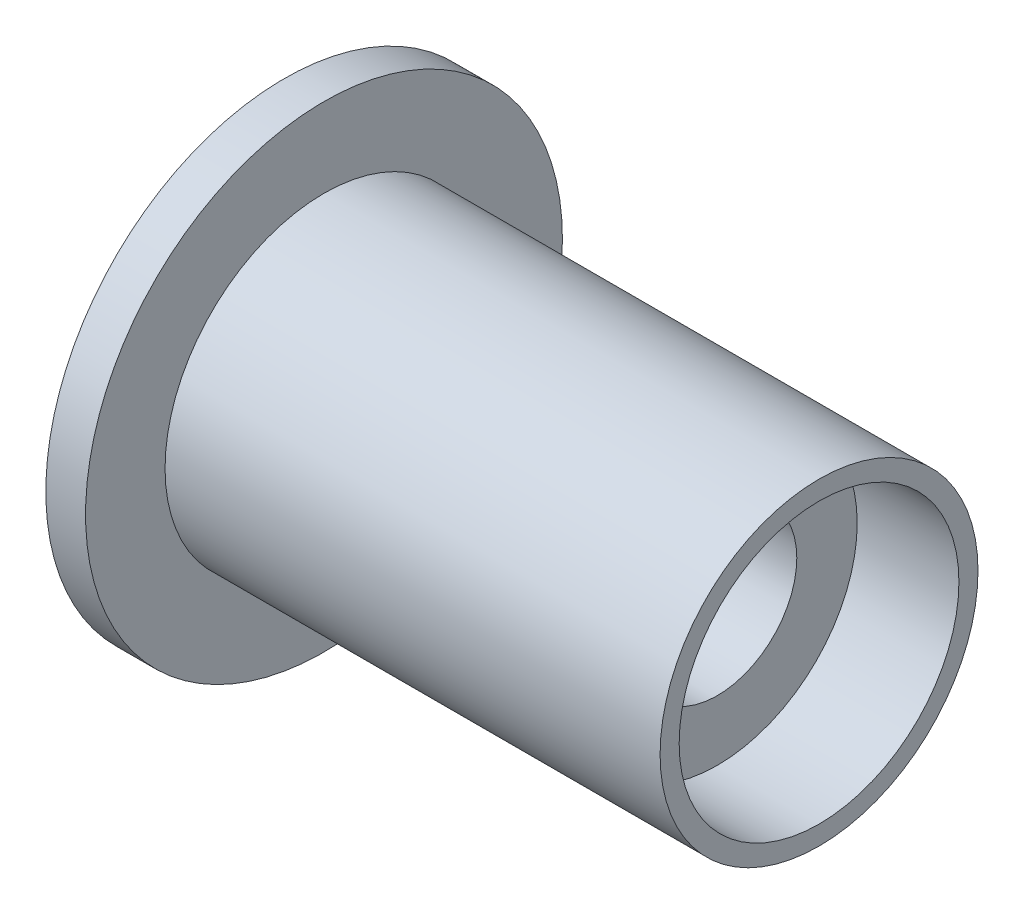
ISO-10303-21;
HEADER;
FILE_DESCRIPTION(('STEP AP214'),'2;1');
FILE_NAME('part.step','',(''),(''),'','','');
FILE_SCHEMA(('AUTOMOTIVE_DESIGN { 1 0 10303 214 1 1 1 1 }'));
ENDSEC;
DATA;
#1=APPLICATION_CONTEXT('core data for automotive mechanical design processes');
#2=APPLICATION_PROTOCOL_DEFINITION('international standard','automotive_design',2000,#1);
#3=PRODUCT_CONTEXT('',#1,'mechanical');
#4=PRODUCT('Part','Part','',(#3));
#5=PRODUCT_RELATED_PRODUCT_CATEGORY('part','',(#4));
#6=PRODUCT_DEFINITION_FORMATION('','',#4);
#7=PRODUCT_DEFINITION_CONTEXT('part definition',#1,'design');
#8=PRODUCT_DEFINITION('design','',#6,#7);
#9=PRODUCT_DEFINITION_SHAPE('','',#8);
#10=(LENGTH_UNIT() NAMED_UNIT(*) SI_UNIT(.MILLI.,.METRE.));
#11=(NAMED_UNIT(*) PLANE_ANGLE_UNIT() SI_UNIT($,.RADIAN.));
#12=(NAMED_UNIT(*) SI_UNIT($,.STERADIAN.) SOLID_ANGLE_UNIT());
#13=UNCERTAINTY_MEASURE_WITH_UNIT(LENGTH_MEASURE(1.E-05),#10,'distance_accuracy_value','');
#14=(GEOMETRIC_REPRESENTATION_CONTEXT(3) GLOBAL_UNCERTAINTY_ASSIGNED_CONTEXT((#13)) GLOBAL_UNIT_ASSIGNED_CONTEXT((#10,
#11,#12)) REPRESENTATION_CONTEXT('',''));
#15=CARTESIAN_POINT('',(0.,0.,0.));
#16=DIRECTION('',(0.,0.,1.));
#17=DIRECTION('',(1.,0.,0.));
#18=AXIS2_PLACEMENT_3D('',#15,#16,#17);
#19=CARTESIAN_POINT('',(21.36394,0.,0.));
#20=DIRECTION('',(1.,0.,0.));
#21=DIRECTION('',(0.,0.,-1.));
#22=AXIS2_PLACEMENT_3D('',#19,#20,#21);
#23=CYLINDRICAL_SURFACE('',#22,3.175);
#24=CARTESIAN_POINT('',(0.,0.,0.));
#25=DIRECTION('',(1.,0.,0.));
#26=DIRECTION('',(0.,0.,-1.));
#27=AXIS2_PLACEMENT_3D('',#24,#25,#26);
#28=CIRCLE('',#27,3.175);
#29=CARTESIAN_POINT('',(0.,0.,-3.175));
#30=VERTEX_POINT('',#29);
#31=EDGE_CURVE('E80',#30,#30,#28,.T.);
#32=ORIENTED_EDGE('',*,*,#31,.F.);
#33=EDGE_LOOP('',(#32));
#34=FACE_BOUND('',#33,.T.);
#35=CARTESIAN_POINT('',(17.29994,0.,0.));
#36=DIRECTION('',(1.,0.,0.));
#37=DIRECTION('',(0.,0.,-1.));
#38=AXIS2_PLACEMENT_3D('',#35,#36,#37);
#39=CIRCLE('',#38,3.175);
#40=CARTESIAN_POINT('',(17.29994,0.,-3.175));
#41=VERTEX_POINT('',#40);
#42=EDGE_CURVE('E10',#41,#41,#39,.T.);
#43=ORIENTED_EDGE('',*,*,#42,.T.);
#44=EDGE_LOOP('',(#43));
#45=FACE_BOUND('',#44,.T.);
#46=ADVANCED_FACE('F45',(#34,#45),#23,.F.);
#47=CARTESIAN_POINT('',(17.29994,0.,0.));
#48=DIRECTION('',(-1.,0.,0.));
#49=DIRECTION('',(0.,0.,1.));
#50=AXIS2_PLACEMENT_3D('',#47,#48,#49);
#51=PLANE('',#50);
#52=ORIENTED_EDGE('',*,*,#42,.F.);
#53=EDGE_LOOP('',(#52));
#54=FACE_BOUND('',#53,.T.);
#55=CARTESIAN_POINT('',(17.29994,0.,0.));
#56=DIRECTION('',(1.,0.,0.));
#57=DIRECTION('',(0.,0.,-1.));
#58=AXIS2_PLACEMENT_3D('',#55,#56,#57);
#59=CIRCLE('',#58,5.588);
#60=CARTESIAN_POINT('',(17.29994,0.,-5.588));
#61=VERTEX_POINT('',#60);
#62=EDGE_CURVE('E52',#61,#61,#59,.T.);
#63=ORIENTED_EDGE('',*,*,#62,.T.);
#64=EDGE_LOOP('',(#63));
#65=FACE_BOUND('',#64,.T.);
#66=ADVANCED_FACE('F88',(#54,#65),#51,.F.);
#67=CARTESIAN_POINT('',(21.36394,0.,0.));
#68=DIRECTION('',(1.,0.,0.));
#69=DIRECTION('',(0.,0.,-1.));
#70=AXIS2_PLACEMENT_3D('',#67,#68,#69);
#71=CYLINDRICAL_SURFACE('',#70,5.588);
#72=ORIENTED_EDGE('',*,*,#62,.F.);
#73=EDGE_LOOP('',(#72));
#74=FACE_BOUND('',#73,.T.);
#75=CARTESIAN_POINT('',(21.36394,0.,0.));
#76=DIRECTION('',(1.,0.,0.));
#77=DIRECTION('',(0.,0.,-1.));
#78=AXIS2_PLACEMENT_3D('',#75,#76,#77);
#79=CIRCLE('',#78,5.588);
#80=CARTESIAN_POINT('',(21.36394,0.,-5.588));
#81=VERTEX_POINT('',#80);
#82=EDGE_CURVE('E57',#81,#81,#79,.T.);
#83=ORIENTED_EDGE('',*,*,#82,.T.);
#84=EDGE_LOOP('',(#83));
#85=FACE_BOUND('',#84,.T.);
#86=ADVANCED_FACE('F92',(#74,#85),#71,.F.);
#87=CARTESIAN_POINT('',(21.36394,0.,0.));
#88=DIRECTION('',(-1.,0.,0.));
#89=DIRECTION('',(0.,0.,1.));
#90=AXIS2_PLACEMENT_3D('',#87,#88,#89);
#91=PLANE('',#90);
#92=ORIENTED_EDGE('',*,*,#82,.F.);
#93=EDGE_LOOP('',(#92));
#94=FACE_BOUND('',#93,.T.);
#95=CARTESIAN_POINT('',(21.36394,0.,0.));
#96=DIRECTION('',(1.,0.,0.));
#97=DIRECTION('',(0.,0.,-1.));
#98=AXIS2_PLACEMENT_3D('',#95,#96,#97);
#99=CIRCLE('',#98,6.35);
#100=CARTESIAN_POINT('',(21.36394,0.,-6.35));
#101=VERTEX_POINT('',#100);
#102=EDGE_CURVE('E62',#101,#101,#99,.T.);
#103=ORIENTED_EDGE('',*,*,#102,.T.);
#104=EDGE_LOOP('',(#103));
#105=FACE_BOUND('',#104,.T.);
#106=ADVANCED_FACE('F97',(#94,#105),#91,.F.);
#107=CARTESIAN_POINT('',(21.36394,0.,0.));
#108=DIRECTION('',(1.,0.,0.));
#109=DIRECTION('',(0.,0.,-1.));
#110=AXIS2_PLACEMENT_3D('',#107,#108,#109);
#111=CYLINDRICAL_SURFACE('',#110,6.35);
#112=ORIENTED_EDGE('',*,*,#102,.F.);
#113=EDGE_LOOP('',(#112));
#114=FACE_BOUND('',#113,.T.);
#115=CARTESIAN_POINT('',(1.5875,0.,0.));
#116=DIRECTION('',(1.,0.,0.));
#117=DIRECTION('',(0.,0.,-1.));
#118=AXIS2_PLACEMENT_3D('',#115,#116,#117);
#119=CIRCLE('',#118,6.35);
#120=CARTESIAN_POINT('',(1.5875,0.,-6.35));
#121=VERTEX_POINT('',#120);
#122=EDGE_CURVE('E68',#121,#121,#119,.T.);
#123=ORIENTED_EDGE('',*,*,#122,.T.);
#124=EDGE_LOOP('',(#123));
#125=FACE_BOUND('',#124,.T.);
#126=ADVANCED_FACE('F103',(#114,#125),#111,.T.);
#127=CARTESIAN_POINT('',(1.5875,0.,0.));
#128=DIRECTION('',(-1.,0.,0.));
#129=DIRECTION('',(0.,0.,1.));
#130=AXIS2_PLACEMENT_3D('',#127,#128,#129);
#131=PLANE('',#130);
#132=ORIENTED_EDGE('',*,*,#122,.F.);
#133=EDGE_LOOP('',(#132));
#134=FACE_BOUND('',#133,.T.);
#135=CARTESIAN_POINT('',(1.5875,0.,0.));
#136=DIRECTION('',(1.,0.,0.));
#137=DIRECTION('',(0.,0.,-1.));
#138=AXIS2_PLACEMENT_3D('',#135,#136,#137);
#139=CIRCLE('',#138,9.525);
#140=CARTESIAN_POINT('',(1.5875,0.,-9.525));
#141=VERTEX_POINT('',#140);
#142=EDGE_CURVE('E72',#141,#141,#139,.T.);
#143=ORIENTED_EDGE('',*,*,#142,.T.);
#144=EDGE_LOOP('',(#143));
#145=FACE_BOUND('',#144,.T.);
#146=ADVANCED_FACE('F107',(#134,#145),#131,.F.);
#147=CARTESIAN_POINT('',(21.36394,0.,0.));
#148=DIRECTION('',(1.,0.,0.));
#149=DIRECTION('',(0.,0.,-1.));
#150=AXIS2_PLACEMENT_3D('',#147,#148,#149);
#151=CYLINDRICAL_SURFACE('',#150,9.525);
#152=ORIENTED_EDGE('',*,*,#142,.F.);
#153=EDGE_LOOP('',(#152));
#154=FACE_BOUND('',#153,.T.);
#155=CARTESIAN_POINT('',(0.,0.,0.));
#156=DIRECTION('',(1.,0.,0.));
#157=DIRECTION('',(0.,0.,-1.));
#158=AXIS2_PLACEMENT_3D('',#155,#156,#157);
#159=CIRCLE('',#158,9.525);
#160=CARTESIAN_POINT('',(0.,0.,-9.525));
#161=VERTEX_POINT('',#160);
#162=EDGE_CURVE('E76',#161,#161,#159,.T.);
#163=ORIENTED_EDGE('',*,*,#162,.T.);
#164=EDGE_LOOP('',(#163));
#165=FACE_BOUND('',#164,.T.);
#166=ADVANCED_FACE('F111',(#154,#165),#151,.T.);
#167=CARTESIAN_POINT('',(0.,0.,0.));
#168=DIRECTION('',(1.,0.,0.));
#169=DIRECTION('',(0.,0.,-1.));
#170=AXIS2_PLACEMENT_3D('',#167,#168,#169);
#171=PLANE('',#170);
#172=ORIENTED_EDGE('',*,*,#162,.F.);
#173=EDGE_LOOP('',(#172));
#174=FACE_BOUND('',#173,.T.);
#175=ORIENTED_EDGE('',*,*,#31,.T.);
#176=EDGE_LOOP('',(#175));
#177=FACE_BOUND('',#176,.T.);
#178=ADVANCED_FACE('F85',(#174,#177),#171,.F.);
#179=CLOSED_SHELL('',(#46,#66,#86,#106,#126,#146,#166,#178));
#180=MANIFOLD_SOLID_BREP('B2',#179);
#181=ADVANCED_BREP_SHAPE_REPRESENTATION('',(#18,#180),#14);
#182=SHAPE_DEFINITION_REPRESENTATION(#9,#181);
ENDSEC;
END-ISO-10303-21;
